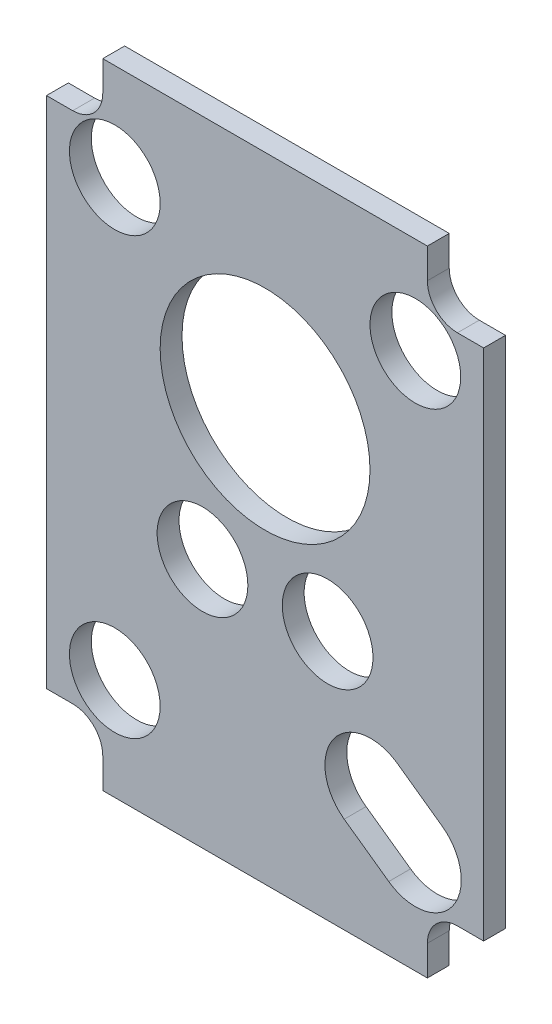
ISO-10303-21;
HEADER;
FILE_DESCRIPTION(('STEP AP214'),'2;1');
FILE_NAME('part.step','',(''),(''),'','','');
FILE_SCHEMA(('AUTOMOTIVE_DESIGN { 1 0 10303 214 1 1 1 1 }'));
ENDSEC;
DATA;
#1=APPLICATION_CONTEXT('core data for automotive mechanical design processes');
#2=APPLICATION_PROTOCOL_DEFINITION('international standard','automotive_design',2000,#1);
#3=PRODUCT_CONTEXT('',#1,'mechanical');
#4=PRODUCT('Part','Part','',(#3));
#5=PRODUCT_RELATED_PRODUCT_CATEGORY('part','',(#4));
#6=PRODUCT_DEFINITION_FORMATION('','',#4);
#7=PRODUCT_DEFINITION_CONTEXT('part definition',#1,'design');
#8=PRODUCT_DEFINITION('design','',#6,#7);
#9=PRODUCT_DEFINITION_SHAPE('','',#8);
#10=(LENGTH_UNIT() NAMED_UNIT(*) SI_UNIT(.MILLI.,.METRE.));
#11=(NAMED_UNIT(*) PLANE_ANGLE_UNIT() SI_UNIT($,.RADIAN.));
#12=(NAMED_UNIT(*) SI_UNIT($,.STERADIAN.) SOLID_ANGLE_UNIT());
#13=UNCERTAINTY_MEASURE_WITH_UNIT(LENGTH_MEASURE(1.E-05),#10,'distance_accuracy_value','');
#14=(GEOMETRIC_REPRESENTATION_CONTEXT(3) GLOBAL_UNCERTAINTY_ASSIGNED_CONTEXT((#13)) GLOBAL_UNIT_ASSIGNED_CONTEXT((#10,
#11,#12)) REPRESENTATION_CONTEXT('',''));
#15=CARTESIAN_POINT('',(0.,0.,0.));
#16=DIRECTION('',(0.,0.,1.));
#17=DIRECTION('',(1.,0.,0.));
#18=AXIS2_PLACEMENT_3D('',#15,#16,#17);
#19=CARTESIAN_POINT('',(9.67691762911674,-16.8,2.));
#20=DIRECTION('',(0.,0.,-1.));
#21=DIRECTION('',(-1.,0.,0.));
#22=AXIS2_PLACEMENT_3D('',#19,#20,#21);
#23=CYLINDRICAL_SURFACE('',#22,4.2);
#24=CARTESIAN_POINT('',(9.67691762911674,-16.8,0.));
#25=DIRECTION('',(0.,0.,1.));
#26=DIRECTION('',(1.,0.,0.));
#27=AXIS2_PLACEMENT_3D('',#24,#25,#26);
#28=CIRCLE('',#27,4.2);
#29=CARTESIAN_POINT('',(12.1129176291167,-13.3786108084581,0.));
#30=VERTEX_POINT('',#29);
#31=CARTESIAN_POINT('',(7.24091762911673,-20.2213891915419,0.));
#32=VERTEX_POINT('',#31);
#33=EDGE_CURVE('E271',#30,#32,#28,.T.);
#34=ORIENTED_EDGE('',*,*,#33,.F.);
#35=DIRECTION('',(0.,0.,-1.));
#36=VECTOR('',#35,1.);
#37=CARTESIAN_POINT('',(12.1129176291167,-13.3786108084581,2.));
#38=LINE('',#37,#36);
#39=CARTESIAN_POINT('',(12.1129176291167,-13.3786108084581,2.));
#40=VERTEX_POINT('',#39);
#41=EDGE_CURVE('E11',#40,#30,#38,.T.);
#42=ORIENTED_EDGE('',*,*,#41,.F.);
#43=CARTESIAN_POINT('',(9.67691762911674,-16.8,2.));
#44=DIRECTION('',(0.,0.,1.));
#45=DIRECTION('',(1.,0.,0.));
#46=AXIS2_PLACEMENT_3D('',#43,#44,#45);
#47=CIRCLE('',#46,4.2);
#48=CARTESIAN_POINT('',(7.24091762911673,-20.2213891915419,2.));
#49=VERTEX_POINT('',#48);
#50=EDGE_CURVE('E199',#40,#49,#47,.T.);
#51=ORIENTED_EDGE('',*,*,#50,.T.);
#52=DIRECTION('',(0.,0.,-1.));
#53=VECTOR('',#52,1.);
#54=CARTESIAN_POINT('',(7.24091762911673,-20.2213891915419,2.));
#55=LINE('',#54,#53);
#56=EDGE_CURVE('E127',#49,#32,#55,.T.);
#57=ORIENTED_EDGE('',*,*,#56,.T.);
#58=EDGE_LOOP('',(#34,#42,#51,#57));
#59=FACE_BOUND('',#58,.T.);
#60=ADVANCED_FACE('F38',(#59),#23,.F.);
#61=CARTESIAN_POINT('',(-2.24630783394242,-3.15496442689925,2.));
#62=DIRECTION('',(-0.580000000000001,-0.814616474176652,0.));
#63=DIRECTION('',(0.814616474176652,-0.580000000000001,0.));
#64=AXIS2_PLACEMENT_3D('',#61,#62,#63);
#65=PLANE('',#64);
#66=DIRECTION('',(-0.814616474176652,0.580000000000001,0.));
#67=VECTOR('',#66,1.);
#68=CARTESIAN_POINT('',(-2.24630783394242,-3.15496442689925,0.));
#69=LINE('',#68,#67);
#70=CARTESIAN_POINT('',(16.186,-16.2786108084581,0.));
#71=VERTEX_POINT('',#70);
#72=EDGE_CURVE('E190',#71,#30,#69,.T.);
#73=ORIENTED_EDGE('',*,*,#72,.F.);
#74=DIRECTION('',(0.,0.,-1.));
#75=VECTOR('',#74,1.);
#76=CARTESIAN_POINT('',(16.186,-16.2786108084581,2.));
#77=LINE('',#76,#75);
#78=CARTESIAN_POINT('',(16.186,-16.2786108084581,2.));
#79=VERTEX_POINT('',#78);
#80=EDGE_CURVE('E48',#79,#71,#77,.T.);
#81=ORIENTED_EDGE('',*,*,#80,.F.);
#82=DIRECTION('',(-0.814616474176652,0.580000000000001,0.));
#83=VECTOR('',#82,1.);
#84=CARTESIAN_POINT('',(-2.24630783394242,-3.15496442689925,2.));
#85=LINE('',#84,#83);
#86=EDGE_CURVE('E188',#79,#40,#85,.T.);
#87=ORIENTED_EDGE('',*,*,#86,.T.);
#88=ORIENTED_EDGE('',*,*,#41,.T.);
#89=EDGE_LOOP('',(#73,#81,#87,#88));
#90=FACE_BOUND('',#89,.T.);
#91=ADVANCED_FACE('F187',(#90),#65,.T.);
#92=CARTESIAN_POINT('',(13.75,-19.7,2.));
#93=DIRECTION('',(0.,0.,-1.));
#94=DIRECTION('',(-1.,0.,0.));
#95=AXIS2_PLACEMENT_3D('',#92,#93,#94);
#96=CYLINDRICAL_SURFACE('',#95,4.2);
#97=CARTESIAN_POINT('',(13.75,-19.7,0.));
#98=DIRECTION('',(0.,0.,1.));
#99=DIRECTION('',(1.,0.,0.));
#100=AXIS2_PLACEMENT_3D('',#97,#98,#99);
#101=CIRCLE('',#100,4.2);
#102=CARTESIAN_POINT('',(11.314,-23.1213891915419,0.));
#103=VERTEX_POINT('',#102);
#104=EDGE_CURVE('E275',#103,#71,#101,.T.);
#105=ORIENTED_EDGE('',*,*,#104,.F.);
#106=DIRECTION('',(0.,0.,-1.));
#107=VECTOR('',#106,1.);
#108=CARTESIAN_POINT('',(11.314,-23.1213891915419,2.));
#109=LINE('',#108,#107);
#110=CARTESIAN_POINT('',(11.314,-23.1213891915419,2.));
#111=VERTEX_POINT('',#110);
#112=EDGE_CURVE('E120',#111,#103,#109,.T.);
#113=ORIENTED_EDGE('',*,*,#112,.F.);
#114=CARTESIAN_POINT('',(13.75,-19.7,2.));
#115=DIRECTION('',(0.,0.,1.));
#116=DIRECTION('',(1.,0.,0.));
#117=AXIS2_PLACEMENT_3D('',#114,#115,#116);
#118=CIRCLE('',#117,4.2);
#119=EDGE_CURVE('E198',#111,#79,#118,.T.);
#120=ORIENTED_EDGE('',*,*,#119,.T.);
#121=ORIENTED_EDGE('',*,*,#80,.T.);
#122=EDGE_LOOP('',(#105,#113,#120,#121));
#123=FACE_BOUND('',#122,.T.);
#124=ADVANCED_FACE('F201',(#123),#96,.F.);
#125=CARTESIAN_POINT('',(17.6,26.25,2.));
#126=DIRECTION('',(0.,0.,-1.));
#127=DIRECTION('',(-1.,0.,0.));
#128=AXIS2_PLACEMENT_3D('',#125,#126,#127);
#129=CYLINDRICAL_SURFACE('',#128,2.75);
#130=CARTESIAN_POINT('',(17.6,26.25,0.));
#131=DIRECTION('',(0.,0.,1.));
#132=DIRECTION('',(1.,0.,0.));
#133=AXIS2_PLACEMENT_3D('',#130,#131,#132);
#134=CIRCLE('',#133,2.75);
#135=CARTESIAN_POINT('',(14.85,26.25,0.));
#136=VERTEX_POINT('',#135);
#137=CARTESIAN_POINT('',(17.6,23.5,0.));
#138=VERTEX_POINT('',#137);
#139=EDGE_CURVE('E216',#136,#138,#134,.T.);
#140=ORIENTED_EDGE('',*,*,#139,.F.);
#141=DIRECTION('',(0.,0.,-1.));
#142=VECTOR('',#141,1.);
#143=CARTESIAN_POINT('',(14.85,26.25,2.));
#144=LINE('',#143,#142);
#145=CARTESIAN_POINT('',(14.85,26.25,2.));
#146=VERTEX_POINT('',#145);
#147=EDGE_CURVE('E42',#146,#136,#144,.T.);
#148=ORIENTED_EDGE('',*,*,#147,.F.);
#149=CARTESIAN_POINT('',(17.6,26.25,2.));
#150=DIRECTION('',(0.,0.,1.));
#151=DIRECTION('',(1.,0.,0.));
#152=AXIS2_PLACEMENT_3D('',#149,#150,#151);
#153=CIRCLE('',#152,2.75);
#154=CARTESIAN_POINT('',(17.6,23.5,2.));
#155=VERTEX_POINT('',#154);
#156=EDGE_CURVE('E288',#146,#155,#153,.T.);
#157=ORIENTED_EDGE('',*,*,#156,.T.);
#158=DIRECTION('',(0.,0.,-1.));
#159=VECTOR('',#158,1.);
#160=CARTESIAN_POINT('',(17.6,23.5,2.));
#161=LINE('',#160,#159);
#162=EDGE_CURVE('E215',#155,#138,#161,.T.);
#163=ORIENTED_EDGE('',*,*,#162,.T.);
#164=EDGE_LOOP('',(#140,#148,#157,#163));
#165=FACE_BOUND('',#164,.T.);
#166=ADVANCED_FACE('F40',(#165),#129,.F.);
#167=CARTESIAN_POINT('',(14.85,0.,2.));
#168=DIRECTION('',(-1.,0.,0.));
#169=DIRECTION('',(0.,-1.,0.));
#170=AXIS2_PLACEMENT_3D('',#167,#168,#169);
#171=PLANE('',#170);
#172=DIRECTION('',(0.,1.,0.));
#173=VECTOR('',#172,1.);
#174=CARTESIAN_POINT('',(14.85,0.,0.));
#175=LINE('',#174,#173);
#176=CARTESIAN_POINT('',(14.85,29.,0.));
#177=VERTEX_POINT('',#176);
#178=EDGE_CURVE('E219',#136,#177,#175,.T.);
#179=ORIENTED_EDGE('',*,*,#178,.T.);
#180=DIRECTION('',(0.,0.,-1.));
#181=VECTOR('',#180,1.);
#182=CARTESIAN_POINT('',(14.85,29.,2.));
#183=LINE('',#182,#181);
#184=CARTESIAN_POINT('',(14.85,29.,2.));
#185=VERTEX_POINT('',#184);
#186=EDGE_CURVE('E318',#185,#177,#183,.T.);
#187=ORIENTED_EDGE('',*,*,#186,.F.);
#188=DIRECTION('',(0.,1.,0.));
#189=VECTOR('',#188,1.);
#190=CARTESIAN_POINT('',(14.85,0.,2.));
#191=LINE('',#190,#189);
#192=EDGE_CURVE('E327',#146,#185,#191,.T.);
#193=ORIENTED_EDGE('',*,*,#192,.F.);
#194=ORIENTED_EDGE('',*,*,#147,.T.);
#195=EDGE_LOOP('',(#179,#187,#193,#194));
#196=FACE_BOUND('',#195,.T.);
#197=ADVANCED_FACE('F326',(#196),#171,.F.);
#198=CARTESIAN_POINT('',(0.,29.,2.));
#199=DIRECTION('',(0.,-1.,0.));
#200=DIRECTION('',(1.,0.,0.));
#201=AXIS2_PLACEMENT_3D('',#198,#199,#200);
#202=PLANE('',#201);
#203=DIRECTION('',(-1.,0.,0.));
#204=VECTOR('',#203,1.);
#205=CARTESIAN_POINT('',(0.,29.,0.));
#206=LINE('',#205,#204);
#207=CARTESIAN_POINT('',(-14.85,29.,0.));
#208=VERTEX_POINT('',#207);
#209=EDGE_CURVE('E221',#177,#208,#206,.T.);
#210=ORIENTED_EDGE('',*,*,#209,.T.);
#211=DIRECTION('',(0.,0.,-1.));
#212=VECTOR('',#211,1.);
#213=CARTESIAN_POINT('',(-14.85,29.,2.));
#214=LINE('',#213,#212);
#215=CARTESIAN_POINT('',(-14.85,29.,2.));
#216=VERTEX_POINT('',#215);
#217=EDGE_CURVE('E317',#216,#208,#214,.T.);
#218=ORIENTED_EDGE('',*,*,#217,.F.);
#219=DIRECTION('',(-1.,0.,0.));
#220=VECTOR('',#219,1.);
#221=CARTESIAN_POINT('',(0.,29.,2.));
#222=LINE('',#221,#220);
#223=EDGE_CURVE('E677',#185,#216,#222,.T.);
#224=ORIENTED_EDGE('',*,*,#223,.F.);
#225=ORIENTED_EDGE('',*,*,#186,.T.);
#226=EDGE_LOOP('',(#210,#218,#224,#225));
#227=FACE_BOUND('',#226,.T.);
#228=ADVANCED_FACE('F409',(#227),#202,.F.);
#229=CARTESIAN_POINT('',(-14.85,0.,2.));
#230=DIRECTION('',(-1.,0.,0.));
#231=DIRECTION('',(0.,-1.,0.));
#232=AXIS2_PLACEMENT_3D('',#229,#230,#231);
#233=PLANE('',#232);
#234=DIRECTION('',(0.,1.,0.));
#235=VECTOR('',#234,1.);
#236=CARTESIAN_POINT('',(-14.85,0.,0.));
#237=LINE('',#236,#235);
#238=CARTESIAN_POINT('',(-14.85,26.25,0.));
#239=VERTEX_POINT('',#238);
#240=EDGE_CURVE('E224',#239,#208,#237,.T.);
#241=ORIENTED_EDGE('',*,*,#240,.F.);
#242=DIRECTION('',(0.,0.,-1.));
#243=VECTOR('',#242,1.);
#244=CARTESIAN_POINT('',(-14.85,26.25,2.));
#245=LINE('',#244,#243);
#246=CARTESIAN_POINT('',(-14.85,26.25,2.));
#247=VERTEX_POINT('',#246);
#248=EDGE_CURVE('E315',#247,#239,#245,.T.);
#249=ORIENTED_EDGE('',*,*,#248,.F.);
#250=DIRECTION('',(0.,1.,0.));
#251=VECTOR('',#250,1.);
#252=CARTESIAN_POINT('',(-14.85,0.,2.));
#253=LINE('',#252,#251);
#254=EDGE_CURVE('E408',#247,#216,#253,.T.);
#255=ORIENTED_EDGE('',*,*,#254,.T.);
#256=ORIENTED_EDGE('',*,*,#217,.T.);
#257=EDGE_LOOP('',(#241,#249,#255,#256));
#258=FACE_BOUND('',#257,.T.);
#259=ADVANCED_FACE('F404',(#258),#233,.T.);
#260=CARTESIAN_POINT('',(-17.6,26.25,2.));
#261=DIRECTION('',(0.,0.,-1.));
#262=DIRECTION('',(-1.,0.,0.));
#263=AXIS2_PLACEMENT_3D('',#260,#261,#262);
#264=CYLINDRICAL_SURFACE('',#263,2.75);
#265=CARTESIAN_POINT('',(-17.6,26.25,0.));
#266=DIRECTION('',(0.,0.,1.));
#267=DIRECTION('',(1.,0.,0.));
#268=AXIS2_PLACEMENT_3D('',#265,#266,#267);
#269=CIRCLE('',#268,2.75);
#270=CARTESIAN_POINT('',(-17.6,23.5,0.));
#271=VERTEX_POINT('',#270);
#272=EDGE_CURVE('E227',#271,#239,#269,.T.);
#273=ORIENTED_EDGE('',*,*,#272,.F.);
#274=DIRECTION('',(0.,0.,-1.));
#275=VECTOR('',#274,1.);
#276=CARTESIAN_POINT('',(-17.6,23.5,2.));
#277=LINE('',#276,#275);
#278=CARTESIAN_POINT('',(-17.6,23.5,2.));
#279=VERTEX_POINT('',#278);
#280=EDGE_CURVE('E313',#279,#271,#277,.T.);
#281=ORIENTED_EDGE('',*,*,#280,.F.);
#282=CARTESIAN_POINT('',(-17.6,26.25,2.));
#283=DIRECTION('',(0.,0.,1.));
#284=DIRECTION('',(1.,0.,0.));
#285=AXIS2_PLACEMENT_3D('',#282,#283,#284);
#286=CIRCLE('',#285,2.75);
#287=EDGE_CURVE('E401',#279,#247,#286,.T.);
#288=ORIENTED_EDGE('',*,*,#287,.T.);
#289=ORIENTED_EDGE('',*,*,#248,.T.);
#290=EDGE_LOOP('',(#273,#281,#288,#289));
#291=FACE_BOUND('',#290,.T.);
#292=ADVANCED_FACE('F400',(#291),#264,.F.);
#293=CARTESIAN_POINT('',(0.,23.5,2.));
#294=DIRECTION('',(0.,-1.,0.));
#295=DIRECTION('',(0.,0.,-1.));
#296=AXIS2_PLACEMENT_3D('',#293,#294,#295);
#297=PLANE('',#296);
#298=DIRECTION('',(-1.,0.,0.));
#299=VECTOR('',#298,1.);
#300=CARTESIAN_POINT('',(0.,23.5,0.));
#301=LINE('',#300,#299);
#302=CARTESIAN_POINT('',(-20.,23.5,0.));
#303=VERTEX_POINT('',#302);
#304=EDGE_CURVE('E230',#271,#303,#301,.T.);
#305=ORIENTED_EDGE('',*,*,#304,.T.);
#306=DIRECTION('',(0.,0.,-1.));
#307=VECTOR('',#306,1.);
#308=CARTESIAN_POINT('',(-20.,23.5,2.));
#309=LINE('',#308,#307);
#310=CARTESIAN_POINT('',(-20.,23.5,2.));
#311=VERTEX_POINT('',#310);
#312=EDGE_CURVE('E311',#311,#303,#309,.T.);
#313=ORIENTED_EDGE('',*,*,#312,.F.);
#314=DIRECTION('',(-1.,0.,0.));
#315=VECTOR('',#314,1.);
#316=CARTESIAN_POINT('',(0.,23.5,2.));
#317=LINE('',#316,#315);
#318=EDGE_CURVE('E396',#279,#311,#317,.T.);
#319=ORIENTED_EDGE('',*,*,#318,.F.);
#320=ORIENTED_EDGE('',*,*,#280,.T.);
#321=EDGE_LOOP('',(#305,#313,#319,#320));
#322=FACE_BOUND('',#321,.T.);
#323=ADVANCED_FACE('F395',(#322),#297,.F.);
#324=CARTESIAN_POINT('',(-20.,0.,2.));
#325=DIRECTION('',(-1.,0.,0.));
#326=DIRECTION('',(0.,0.,1.));
#327=AXIS2_PLACEMENT_3D('',#324,#325,#326);
#328=PLANE('',#327);
#329=DIRECTION('',(0.,1.,0.));
#330=VECTOR('',#329,1.);
#331=CARTESIAN_POINT('',(-20.,0.,0.));
#332=LINE('',#331,#330);
#333=CARTESIAN_POINT('',(-20.,-23.5,0.));
#334=VERTEX_POINT('',#333);
#335=EDGE_CURVE('E233',#334,#303,#332,.T.);
#336=ORIENTED_EDGE('',*,*,#335,.F.);
#337=DIRECTION('',(0.,0.,-1.));
#338=VECTOR('',#337,1.);
#339=CARTESIAN_POINT('',(-20.,-23.5,2.));
#340=LINE('',#339,#338);
#341=CARTESIAN_POINT('',(-20.,-23.5,2.));
#342=VERTEX_POINT('',#341);
#343=EDGE_CURVE('E309',#342,#334,#340,.T.);
#344=ORIENTED_EDGE('',*,*,#343,.F.);
#345=DIRECTION('',(0.,1.,0.));
#346=VECTOR('',#345,1.);
#347=CARTESIAN_POINT('',(-20.,0.,2.));
#348=LINE('',#347,#346);
#349=EDGE_CURVE('E392',#342,#311,#348,.T.);
#350=ORIENTED_EDGE('',*,*,#349,.T.);
#351=ORIENTED_EDGE('',*,*,#312,.T.);
#352=EDGE_LOOP('',(#336,#344,#350,#351));
#353=FACE_BOUND('',#352,.T.);
#354=ADVANCED_FACE('F388',(#353),#328,.T.);
#355=CARTESIAN_POINT('',(0.,-23.4999999999999,2.));
#356=DIRECTION('',(0.,-1.,0.));
#357=DIRECTION('',(1.,0.,0.));
#358=AXIS2_PLACEMENT_3D('',#355,#356,#357);
#359=PLANE('',#358);
#360=DIRECTION('',(-1.,0.,0.));
#361=VECTOR('',#360,1.);
#362=CARTESIAN_POINT('',(0.,-23.4999999999999,0.));
#363=LINE('',#362,#361);
#364=CARTESIAN_POINT('',(-17.6,-23.5,0.));
#365=VERTEX_POINT('',#364);
#366=EDGE_CURVE('E236',#365,#334,#363,.T.);
#367=ORIENTED_EDGE('',*,*,#366,.F.);
#368=DIRECTION('',(0.,0.,-1.));
#369=VECTOR('',#368,1.);
#370=CARTESIAN_POINT('',(-17.6,-23.5,2.));
#371=LINE('',#370,#369);
#372=CARTESIAN_POINT('',(-17.6,-23.5,2.));
#373=VERTEX_POINT('',#372);
#374=EDGE_CURVE('E307',#373,#365,#371,.T.);
#375=ORIENTED_EDGE('',*,*,#374,.F.);
#376=DIRECTION('',(-1.,0.,0.));
#377=VECTOR('',#376,1.);
#378=CARTESIAN_POINT('',(0.,-23.4999999999999,2.));
#379=LINE('',#378,#377);
#380=EDGE_CURVE('E671',#373,#342,#379,.T.);
#381=ORIENTED_EDGE('',*,*,#380,.T.);
#382=ORIENTED_EDGE('',*,*,#343,.T.);
#383=EDGE_LOOP('',(#367,#375,#381,#382));
#384=FACE_BOUND('',#383,.T.);
#385=ADVANCED_FACE('F383',(#384),#359,.T.);
#386=CARTESIAN_POINT('',(-17.6,-26.25,2.));
#387=DIRECTION('',(0.,0.,-1.));
#388=DIRECTION('',(-1.,0.,0.));
#389=AXIS2_PLACEMENT_3D('',#386,#387,#388);
#390=CYLINDRICAL_SURFACE('',#389,2.75);
#391=CARTESIAN_POINT('',(-17.6,-26.25,0.));
#392=DIRECTION('',(0.,0.,1.));
#393=DIRECTION('',(1.,0.,0.));
#394=AXIS2_PLACEMENT_3D('',#391,#392,#393);
#395=CIRCLE('',#394,2.75);
#396=CARTESIAN_POINT('',(-14.85,-26.25,0.));
#397=VERTEX_POINT('',#396);
#398=EDGE_CURVE('E239',#397,#365,#395,.T.);
#399=ORIENTED_EDGE('',*,*,#398,.F.);
#400=DIRECTION('',(0.,0.,-1.));
#401=VECTOR('',#400,1.);
#402=CARTESIAN_POINT('',(-14.85,-26.25,2.));
#403=LINE('',#402,#401);
#404=CARTESIAN_POINT('',(-14.85,-26.25,2.));
#405=VERTEX_POINT('',#404);
#406=EDGE_CURVE('E305',#405,#397,#403,.T.);
#407=ORIENTED_EDGE('',*,*,#406,.F.);
#408=CARTESIAN_POINT('',(-17.6,-26.25,2.));
#409=DIRECTION('',(0.,0.,1.));
#410=DIRECTION('',(1.,0.,0.));
#411=AXIS2_PLACEMENT_3D('',#408,#409,#410);
#412=CIRCLE('',#411,2.75);
#413=EDGE_CURVE('E379',#405,#373,#412,.T.);
#414=ORIENTED_EDGE('',*,*,#413,.T.);
#415=ORIENTED_EDGE('',*,*,#374,.T.);
#416=EDGE_LOOP('',(#399,#407,#414,#415));
#417=FACE_BOUND('',#416,.T.);
#418=ADVANCED_FACE('F375',(#417),#390,.F.);
#419=CARTESIAN_POINT('',(-14.85,0.,2.));
#420=DIRECTION('',(1.,0.,0.));
#421=DIRECTION('',(0.,1.,0.));
#422=AXIS2_PLACEMENT_3D('',#419,#420,#421);
#423=PLANE('',#422);
#424=DIRECTION('',(0.,-1.,0.));
#425=VECTOR('',#424,1.);
#426=CARTESIAN_POINT('',(-14.85,0.,0.));
#427=LINE('',#426,#425);
#428=CARTESIAN_POINT('',(-14.85,-29.,0.));
#429=VERTEX_POINT('',#428);
#430=EDGE_CURVE('E242',#397,#429,#427,.T.);
#431=ORIENTED_EDGE('',*,*,#430,.T.);
#432=DIRECTION('',(0.,0.,-1.));
#433=VECTOR('',#432,1.);
#434=CARTESIAN_POINT('',(-14.85,-29.,2.));
#435=LINE('',#434,#433);
#436=CARTESIAN_POINT('',(-14.85,-29.,2.));
#437=VERTEX_POINT('',#436);
#438=EDGE_CURVE('E303',#437,#429,#435,.T.);
#439=ORIENTED_EDGE('',*,*,#438,.F.);
#440=DIRECTION('',(0.,-1.,0.));
#441=VECTOR('',#440,1.);
#442=CARTESIAN_POINT('',(-14.85,0.,2.));
#443=LINE('',#442,#441);
#444=EDGE_CURVE('E668',#405,#437,#443,.T.);
#445=ORIENTED_EDGE('',*,*,#444,.F.);
#446=ORIENTED_EDGE('',*,*,#406,.T.);
#447=EDGE_LOOP('',(#431,#439,#445,#446));
#448=FACE_BOUND('',#447,.T.);
#449=ADVANCED_FACE('F372',(#448),#423,.F.);
#450=CARTESIAN_POINT('',(0.,-29.,2.));
#451=DIRECTION('',(0.,-1.,0.));
#452=DIRECTION('',(1.,0.,0.));
#453=AXIS2_PLACEMENT_3D('',#450,#451,#452);
#454=PLANE('',#453);
#455=DIRECTION('',(-1.,0.,0.));
#456=VECTOR('',#455,1.);
#457=CARTESIAN_POINT('',(0.,-29.,0.));
#458=LINE('',#457,#456);
#459=CARTESIAN_POINT('',(14.85,-29.,0.));
#460=VERTEX_POINT('',#459);
#461=EDGE_CURVE('E245',#460,#429,#458,.T.);
#462=ORIENTED_EDGE('',*,*,#461,.F.);
#463=DIRECTION('',(0.,0.,-1.));
#464=VECTOR('',#463,1.);
#465=CARTESIAN_POINT('',(14.85,-29.,2.));
#466=LINE('',#465,#464);
#467=CARTESIAN_POINT('',(14.85,-29.,2.));
#468=VERTEX_POINT('',#467);
#469=EDGE_CURVE('E301',#468,#460,#466,.T.);
#470=ORIENTED_EDGE('',*,*,#469,.F.);
#471=DIRECTION('',(-1.,0.,0.));
#472=VECTOR('',#471,1.);
#473=CARTESIAN_POINT('',(0.,-29.,2.));
#474=LINE('',#473,#472);
#475=EDGE_CURVE('E369',#468,#437,#474,.T.);
#476=ORIENTED_EDGE('',*,*,#475,.T.);
#477=ORIENTED_EDGE('',*,*,#438,.T.);
#478=EDGE_LOOP('',(#462,#470,#476,#477));
#479=FACE_BOUND('',#478,.T.);
#480=ADVANCED_FACE('F367',(#479),#454,.T.);
#481=CARTESIAN_POINT('',(14.85,0.,2.));
#482=DIRECTION('',(1.,0.,0.));
#483=DIRECTION('',(0.,1.,0.));
#484=AXIS2_PLACEMENT_3D('',#481,#482,#483);
#485=PLANE('',#484);
#486=DIRECTION('',(0.,-1.,0.));
#487=VECTOR('',#486,1.);
#488=CARTESIAN_POINT('',(14.85,0.,0.));
#489=LINE('',#488,#487);
#490=CARTESIAN_POINT('',(14.85,-26.25,0.));
#491=VERTEX_POINT('',#490);
#492=EDGE_CURVE('E248',#491,#460,#489,.T.);
#493=ORIENTED_EDGE('',*,*,#492,.F.);
#494=DIRECTION('',(0.,0.,-1.));
#495=VECTOR('',#494,1.);
#496=CARTESIAN_POINT('',(14.85,-26.25,2.));
#497=LINE('',#496,#495);
#498=CARTESIAN_POINT('',(14.85,-26.25,2.));
#499=VERTEX_POINT('',#498);
#500=EDGE_CURVE('E299',#499,#491,#497,.T.);
#501=ORIENTED_EDGE('',*,*,#500,.F.);
#502=DIRECTION('',(0.,-1.,0.));
#503=VECTOR('',#502,1.);
#504=CARTESIAN_POINT('',(14.85,0.,2.));
#505=LINE('',#504,#503);
#506=EDGE_CURVE('E363',#499,#468,#505,.T.);
#507=ORIENTED_EDGE('',*,*,#506,.T.);
#508=ORIENTED_EDGE('',*,*,#469,.T.);
#509=EDGE_LOOP('',(#493,#501,#507,#508));
#510=FACE_BOUND('',#509,.T.);
#511=ADVANCED_FACE('F360',(#510),#485,.T.);
#512=CARTESIAN_POINT('',(17.6,-26.25,2.));
#513=DIRECTION('',(0.,0.,-1.));
#514=DIRECTION('',(-1.,0.,0.));
#515=AXIS2_PLACEMENT_3D('',#512,#513,#514);
#516=CYLINDRICAL_SURFACE('',#515,2.75);
#517=CARTESIAN_POINT('',(17.6,-26.25,0.));
#518=DIRECTION('',(0.,0.,1.));
#519=DIRECTION('',(1.,0.,0.));
#520=AXIS2_PLACEMENT_3D('',#517,#518,#519);
#521=CIRCLE('',#520,2.75);
#522=CARTESIAN_POINT('',(17.6,-23.5,0.));
#523=VERTEX_POINT('',#522);
#524=EDGE_CURVE('E251',#523,#491,#521,.T.);
#525=ORIENTED_EDGE('',*,*,#524,.F.);
#526=DIRECTION('',(0.,0.,-1.));
#527=VECTOR('',#526,1.);
#528=CARTESIAN_POINT('',(17.6,-23.5,2.));
#529=LINE('',#528,#527);
#530=CARTESIAN_POINT('',(17.6,-23.5,2.));
#531=VERTEX_POINT('',#530);
#532=EDGE_CURVE('E297',#531,#523,#529,.T.);
#533=ORIENTED_EDGE('',*,*,#532,.F.);
#534=CARTESIAN_POINT('',(17.6,-26.25,2.));
#535=DIRECTION('',(0.,0.,1.));
#536=DIRECTION('',(1.,0.,0.));
#537=AXIS2_PLACEMENT_3D('',#534,#535,#536);
#538=CIRCLE('',#537,2.75);
#539=EDGE_CURVE('E355',#531,#499,#538,.T.);
#540=ORIENTED_EDGE('',*,*,#539,.T.);
#541=ORIENTED_EDGE('',*,*,#500,.T.);
#542=EDGE_LOOP('',(#525,#533,#540,#541));
#543=FACE_BOUND('',#542,.T.);
#544=ADVANCED_FACE('F354',(#543),#516,.F.);
#545=CARTESIAN_POINT('',(0.,-23.4999999999999,2.));
#546=DIRECTION('',(0.,1.,0.));
#547=DIRECTION('',(-1.,0.,0.));
#548=AXIS2_PLACEMENT_3D('',#545,#546,#547);
#549=PLANE('',#548);
#550=DIRECTION('',(1.,0.,0.));
#551=VECTOR('',#550,1.);
#552=CARTESIAN_POINT('',(0.,-23.4999999999999,0.));
#553=LINE('',#552,#551);
#554=CARTESIAN_POINT('',(20.,-23.5,0.));
#555=VERTEX_POINT('',#554);
#556=EDGE_CURVE('E254',#523,#555,#553,.T.);
#557=ORIENTED_EDGE('',*,*,#556,.T.);
#558=DIRECTION('',(0.,0.,-1.));
#559=VECTOR('',#558,1.);
#560=CARTESIAN_POINT('',(20.,-23.5,2.));
#561=LINE('',#560,#559);
#562=CARTESIAN_POINT('',(20.,-23.5,2.));
#563=VERTEX_POINT('',#562);
#564=EDGE_CURVE('E294',#563,#555,#561,.T.);
#565=ORIENTED_EDGE('',*,*,#564,.F.);
#566=DIRECTION('',(1.,0.,0.));
#567=VECTOR('',#566,1.);
#568=CARTESIAN_POINT('',(0.,-23.4999999999999,2.));
#569=LINE('',#568,#567);
#570=EDGE_CURVE('E350',#531,#563,#569,.T.);
#571=ORIENTED_EDGE('',*,*,#570,.F.);
#572=ORIENTED_EDGE('',*,*,#532,.T.);
#573=EDGE_LOOP('',(#557,#565,#571,#572));
#574=FACE_BOUND('',#573,.T.);
#575=ADVANCED_FACE('F349',(#574),#549,.F.);
#576=CARTESIAN_POINT('',(20.,0.,2.));
#577=DIRECTION('',(-1.,0.,0.));
#578=DIRECTION('',(0.,0.,1.));
#579=AXIS2_PLACEMENT_3D('',#576,#577,#578);
#580=PLANE('',#579);
#581=DIRECTION('',(0.,1.,0.));
#582=VECTOR('',#581,1.);
#583=CARTESIAN_POINT('',(20.,0.,0.));
#584=LINE('',#583,#582);
#585=CARTESIAN_POINT('',(20.,23.5,0.));
#586=VERTEX_POINT('',#585);
#587=EDGE_CURVE('E256',#555,#586,#584,.T.);
#588=ORIENTED_EDGE('',*,*,#587,.T.);
#589=DIRECTION('',(0.,0.,-1.));
#590=VECTOR('',#589,1.);
#591=CARTESIAN_POINT('',(20.,23.5,2.));
#592=LINE('',#591,#590);
#593=CARTESIAN_POINT('',(20.,23.5,2.));
#594=VERTEX_POINT('',#593);
#595=EDGE_CURVE('E292',#594,#586,#592,.T.);
#596=ORIENTED_EDGE('',*,*,#595,.F.);
#597=DIRECTION('',(0.,1.,0.));
#598=VECTOR('',#597,1.);
#599=CARTESIAN_POINT('',(20.,0.,2.));
#600=LINE('',#599,#598);
#601=EDGE_CURVE('E346',#563,#594,#600,.T.);
#602=ORIENTED_EDGE('',*,*,#601,.F.);
#603=ORIENTED_EDGE('',*,*,#564,.T.);
#604=EDGE_LOOP('',(#588,#596,#602,#603));
#605=FACE_BOUND('',#604,.T.);
#606=ADVANCED_FACE('F343',(#605),#580,.F.);
#607=CARTESIAN_POINT('',(13.75,20.15,2.));
#608=DIRECTION('',(0.,0.,-1.));
#609=DIRECTION('',(-1.,0.,0.));
#610=AXIS2_PLACEMENT_3D('',#607,#608,#609);
#611=CYLINDRICAL_SURFACE('',#610,4.15);
#612=CARTESIAN_POINT('',(13.75,20.15,2.));
#613=DIRECTION('',(0.,0.,1.));
#614=DIRECTION('',(1.,0.,0.));
#615=AXIS2_PLACEMENT_3D('',#612,#613,#614);
#616=CIRCLE('',#615,4.15);
#617=CARTESIAN_POINT('',(17.9,20.15,2.));
#618=VERTEX_POINT('',#617);
#619=EDGE_CURVE('E209',#618,#618,#616,.T.);
#620=ORIENTED_EDGE('',*,*,#619,.T.);
#621=EDGE_LOOP('',(#620));
#622=FACE_BOUND('',#621,.T.);
#623=CARTESIAN_POINT('',(13.75,20.15,0.));
#624=DIRECTION('',(0.,0.,1.));
#625=DIRECTION('',(1.,0.,0.));
#626=AXIS2_PLACEMENT_3D('',#623,#624,#625);
#627=CIRCLE('',#626,4.15);
#628=CARTESIAN_POINT('',(17.9,20.15,0.));
#629=VERTEX_POINT('',#628);
#630=EDGE_CURVE('E282',#629,#629,#627,.T.);
#631=ORIENTED_EDGE('',*,*,#630,.F.);
#632=EDGE_LOOP('',(#631));
#633=FACE_BOUND('',#632,.T.);
#634=ADVANCED_FACE('F443',(#622,#633),#611,.F.);
#635=CARTESIAN_POINT('',(-13.75,-19.7,2.));
#636=DIRECTION('',(0.,0.,-1.));
#637=DIRECTION('',(-1.,0.,0.));
#638=AXIS2_PLACEMENT_3D('',#635,#636,#637);
#639=CYLINDRICAL_SURFACE('',#638,4.15);
#640=CARTESIAN_POINT('',(-13.75,-19.7,2.));
#641=DIRECTION('',(0.,0.,1.));
#642=DIRECTION('',(1.,0.,0.));
#643=AXIS2_PLACEMENT_3D('',#640,#641,#642);
#644=CIRCLE('',#643,4.15);
#645=CARTESIAN_POINT('',(-9.6,-19.7,2.));
#646=VERTEX_POINT('',#645);
#647=EDGE_CURVE('E203',#646,#646,#644,.T.);
#648=ORIENTED_EDGE('',*,*,#647,.T.);
#649=EDGE_LOOP('',(#648));
#650=FACE_BOUND('',#649,.T.);
#651=CARTESIAN_POINT('',(-13.75,-19.7,0.));
#652=DIRECTION('',(0.,0.,1.));
#653=DIRECTION('',(1.,0.,0.));
#654=AXIS2_PLACEMENT_3D('',#651,#652,#653);
#655=CIRCLE('',#654,4.15);
#656=CARTESIAN_POINT('',(-9.6,-19.7,0.));
#657=VERTEX_POINT('',#656);
#658=EDGE_CURVE('E279',#657,#657,#655,.T.);
#659=ORIENTED_EDGE('',*,*,#658,.F.);
#660=EDGE_LOOP('',(#659));
#661=FACE_BOUND('',#660,.T.);
#662=ADVANCED_FACE('F513',(#650,#661),#639,.F.);
#663=CARTESIAN_POINT('',(-7.11830783394243,-9.99774280998312,2.));
#664=DIRECTION('',(-0.580000000000001,-0.814616474176652,0.));
#665=DIRECTION('',(0.814616474176652,-0.580000000000001,0.));
#666=AXIS2_PLACEMENT_3D('',#663,#664,#665);
#667=PLANE('',#666);
#668=DIRECTION('',(-0.814616474176652,0.580000000000001,0.));
#669=VECTOR('',#668,1.);
#670=CARTESIAN_POINT('',(-7.11830783394243,-9.99774280998312,0.));
#671=LINE('',#670,#669);
#672=EDGE_CURVE('E277',#103,#32,#671,.T.);
#673=ORIENTED_EDGE('',*,*,#672,.T.);
#674=ORIENTED_EDGE('',*,*,#56,.F.);
#675=DIRECTION('',(-0.814616474176652,0.580000000000001,0.));
#676=VECTOR('',#675,1.);
#677=CARTESIAN_POINT('',(-7.11830783394243,-9.99774280998312,2.));
#678=LINE('',#677,#676);
#679=EDGE_CURVE('E57',#111,#49,#678,.T.);
#680=ORIENTED_EDGE('',*,*,#679,.F.);
#681=ORIENTED_EDGE('',*,*,#112,.T.);
#682=EDGE_LOOP('',(#673,#674,#680,#681));
#683=FACE_BOUND('',#682,.T.);
#684=ADVANCED_FACE('F429',(#683),#667,.F.);
#685=CARTESIAN_POINT('',(0.,8.65,2.));
#686=DIRECTION('',(0.,0.,-1.));
#687=DIRECTION('',(-1.,0.,0.));
#688=AXIS2_PLACEMENT_3D('',#685,#686,#687);
#689=CYLINDRICAL_SURFACE('',#688,9.6);
#690=CARTESIAN_POINT('',(0.,8.65,2.));
#691=DIRECTION('',(0.,0.,1.));
#692=DIRECTION('',(1.,0.,0.));
#693=AXIS2_PLACEMENT_3D('',#690,#691,#692);
#694=CIRCLE('',#693,9.6);
#695=CARTESIAN_POINT('',(9.6,8.65,2.));
#696=VERTEX_POINT('',#695);
#697=EDGE_CURVE('E657',#696,#696,#694,.T.);
#698=ORIENTED_EDGE('',*,*,#697,.T.);
#699=EDGE_LOOP('',(#698));
#700=FACE_BOUND('',#699,.T.);
#701=CARTESIAN_POINT('',(0.,8.65,0.));
#702=DIRECTION('',(0.,0.,1.));
#703=DIRECTION('',(1.,0.,0.));
#704=AXIS2_PLACEMENT_3D('',#701,#702,#703);
#705=CIRCLE('',#704,9.6);
#706=CARTESIAN_POINT('',(9.6,8.65,0.));
#707=VERTEX_POINT('',#706);
#708=EDGE_CURVE('E268',#707,#707,#705,.T.);
#709=ORIENTED_EDGE('',*,*,#708,.F.);
#710=EDGE_LOOP('',(#709));
#711=FACE_BOUND('',#710,.T.);
#712=ADVANCED_FACE('F425',(#700,#711),#689,.F.);
#713=CARTESIAN_POINT('',(-5.725,-6.1,2.));
#714=DIRECTION('',(0.,0.,-1.));
#715=DIRECTION('',(-1.,0.,0.));
#716=AXIS2_PLACEMENT_3D('',#713,#714,#715);
#717=CYLINDRICAL_SURFACE('',#716,4.15);
#718=CARTESIAN_POINT('',(-5.725,-6.1,2.));
#719=DIRECTION('',(0.,0.,1.));
#720=DIRECTION('',(1.,0.,0.));
#721=AXIS2_PLACEMENT_3D('',#718,#719,#720);
#722=CIRCLE('',#721,4.15);
#723=CARTESIAN_POINT('',(-1.575,-6.1,2.));
#724=VERTEX_POINT('',#723);
#725=EDGE_CURVE('E654',#724,#724,#722,.T.);
#726=ORIENTED_EDGE('',*,*,#725,.T.);
#727=EDGE_LOOP('',(#726));
#728=FACE_BOUND('',#727,.T.);
#729=CARTESIAN_POINT('',(-5.725,-6.1,0.));
#730=DIRECTION('',(0.,0.,1.));
#731=DIRECTION('',(1.,0.,0.));
#732=AXIS2_PLACEMENT_3D('',#729,#730,#731);
#733=CIRCLE('',#732,4.15);
#734=CARTESIAN_POINT('',(-1.575,-6.1,0.));
#735=VERTEX_POINT('',#734);
#736=EDGE_CURVE('E265',#735,#735,#733,.T.);
#737=ORIENTED_EDGE('',*,*,#736,.F.);
#738=EDGE_LOOP('',(#737));
#739=FACE_BOUND('',#738,.T.);
#740=ADVANCED_FACE('F428',(#728,#739),#717,.F.);
#741=CARTESIAN_POINT('',(5.725,-6.1,2.));
#742=DIRECTION('',(0.,0.,-1.));
#743=DIRECTION('',(-1.,0.,0.));
#744=AXIS2_PLACEMENT_3D('',#741,#742,#743);
#745=CYLINDRICAL_SURFACE('',#744,4.15);
#746=CARTESIAN_POINT('',(5.725,-6.1,2.));
#747=DIRECTION('',(0.,0.,1.));
#748=DIRECTION('',(1.,0.,0.));
#749=AXIS2_PLACEMENT_3D('',#746,#747,#748);
#750=CIRCLE('',#749,4.15);
#751=CARTESIAN_POINT('',(9.875,-6.1,2.));
#752=VERTEX_POINT('',#751);
#753=EDGE_CURVE('E650',#752,#752,#750,.T.);
#754=ORIENTED_EDGE('',*,*,#753,.T.);
#755=EDGE_LOOP('',(#754));
#756=FACE_BOUND('',#755,.T.);
#757=CARTESIAN_POINT('',(5.725,-6.1,0.));
#758=DIRECTION('',(0.,0.,1.));
#759=DIRECTION('',(1.,0.,0.));
#760=AXIS2_PLACEMENT_3D('',#757,#758,#759);
#761=CIRCLE('',#760,4.15);
#762=CARTESIAN_POINT('',(9.875,-6.1,0.));
#763=VERTEX_POINT('',#762);
#764=EDGE_CURVE('E262',#763,#763,#761,.T.);
#765=ORIENTED_EDGE('',*,*,#764,.F.);
#766=EDGE_LOOP('',(#765));
#767=FACE_BOUND('',#766,.T.);
#768=ADVANCED_FACE('F433',(#756,#767),#745,.F.);
#769=CARTESIAN_POINT('',(0.,23.5,2.));
#770=DIRECTION('',(0.,1.,0.));
#771=DIRECTION('',(-1.,0.,0.));
#772=AXIS2_PLACEMENT_3D('',#769,#770,#771);
#773=PLANE('',#772);
#774=DIRECTION('',(1.,0.,0.));
#775=VECTOR('',#774,1.);
#776=CARTESIAN_POINT('',(0.,23.5,0.));
#777=LINE('',#776,#775);
#778=EDGE_CURVE('E259',#138,#586,#777,.T.);
#779=ORIENTED_EDGE('',*,*,#778,.F.);
#780=ORIENTED_EDGE('',*,*,#162,.F.);
#781=DIRECTION('',(1.,0.,0.));
#782=VECTOR('',#781,1.);
#783=CARTESIAN_POINT('',(0.,23.5,2.));
#784=LINE('',#783,#782);
#785=EDGE_CURVE('E337',#155,#594,#784,.T.);
#786=ORIENTED_EDGE('',*,*,#785,.T.);
#787=ORIENTED_EDGE('',*,*,#595,.T.);
#788=EDGE_LOOP('',(#779,#780,#786,#787));
#789=FACE_BOUND('',#788,.T.);
#790=ADVANCED_FACE('F336',(#789),#773,.T.);
#791=CARTESIAN_POINT('',(-13.75,20.15,2.));
#792=DIRECTION('',(0.,0.,-1.));
#793=DIRECTION('',(-1.,0.,0.));
#794=AXIS2_PLACEMENT_3D('',#791,#792,#793);
#795=CYLINDRICAL_SURFACE('',#794,4.15);
#796=CARTESIAN_POINT('',(-13.75,20.15,2.));
#797=DIRECTION('',(0.,0.,1.));
#798=DIRECTION('',(1.,0.,0.));
#799=AXIS2_PLACEMENT_3D('',#796,#797,#798);
#800=CIRCLE('',#799,4.15);
#801=CARTESIAN_POINT('',(-9.6,20.15,2.));
#802=VERTEX_POINT('',#801);
#803=EDGE_CURVE('E212',#802,#802,#800,.T.);
#804=ORIENTED_EDGE('',*,*,#803,.T.);
#805=EDGE_LOOP('',(#804));
#806=FACE_BOUND('',#805,.T.);
#807=CARTESIAN_POINT('',(-13.75,20.15,0.));
#808=DIRECTION('',(0.,0.,1.));
#809=DIRECTION('',(1.,0.,0.));
#810=AXIS2_PLACEMENT_3D('',#807,#808,#809);
#811=CIRCLE('',#810,4.15);
#812=CARTESIAN_POINT('',(-9.6,20.15,0.));
#813=VERTEX_POINT('',#812);
#814=EDGE_CURVE('E285',#813,#813,#811,.T.);
#815=ORIENTED_EDGE('',*,*,#814,.F.);
#816=EDGE_LOOP('',(#815));
#817=FACE_BOUND('',#816,.T.);
#818=ADVANCED_FACE('F440',(#806,#817),#795,.F.);
#819=CARTESIAN_POINT('',(0.,0.,2.));
#820=DIRECTION('',(0.,0.,1.));
#821=DIRECTION('',(1.,0.,0.));
#822=AXIS2_PLACEMENT_3D('',#819,#820,#821);
#823=PLANE('',#822);
#824=ORIENTED_EDGE('',*,*,#156,.F.);
#825=ORIENTED_EDGE('',*,*,#192,.T.);
#826=ORIENTED_EDGE('',*,*,#223,.T.);
#827=ORIENTED_EDGE('',*,*,#254,.F.);
#828=ORIENTED_EDGE('',*,*,#287,.F.);
#829=ORIENTED_EDGE('',*,*,#318,.T.);
#830=ORIENTED_EDGE('',*,*,#349,.F.);
#831=ORIENTED_EDGE('',*,*,#380,.F.);
#832=ORIENTED_EDGE('',*,*,#413,.F.);
#833=ORIENTED_EDGE('',*,*,#444,.T.);
#834=ORIENTED_EDGE('',*,*,#475,.F.);
#835=ORIENTED_EDGE('',*,*,#506,.F.);
#836=ORIENTED_EDGE('',*,*,#539,.F.);
#837=ORIENTED_EDGE('',*,*,#570,.T.);
#838=ORIENTED_EDGE('',*,*,#601,.T.);
#839=ORIENTED_EDGE('',*,*,#785,.F.);
#840=EDGE_LOOP('',(#824,#825,#826,#827,#828,#829,#830,#831,#832,#833,#834,#835,#836,#837,#838,#839));
#841=FACE_BOUND('',#840,.T.);
#842=ORIENTED_EDGE('',*,*,#753,.F.);
#843=EDGE_LOOP('',(#842));
#844=FACE_BOUND('',#843,.T.);
#845=ORIENTED_EDGE('',*,*,#725,.F.);
#846=EDGE_LOOP('',(#845));
#847=FACE_BOUND('',#846,.T.);
#848=ORIENTED_EDGE('',*,*,#697,.F.);
#849=EDGE_LOOP('',(#848));
#850=FACE_BOUND('',#849,.T.);
#851=ORIENTED_EDGE('',*,*,#50,.F.);
#852=ORIENTED_EDGE('',*,*,#86,.F.);
#853=ORIENTED_EDGE('',*,*,#119,.F.);
#854=ORIENTED_EDGE('',*,*,#679,.T.);
#855=EDGE_LOOP('',(#851,#852,#853,#854));
#856=FACE_BOUND('',#855,.T.);
#857=ORIENTED_EDGE('',*,*,#647,.F.);
#858=EDGE_LOOP('',(#857));
#859=FACE_BOUND('',#858,.T.);
#860=ORIENTED_EDGE('',*,*,#619,.F.);
#861=EDGE_LOOP('',(#860));
#862=FACE_BOUND('',#861,.T.);
#863=ORIENTED_EDGE('',*,*,#803,.F.);
#864=EDGE_LOOP('',(#863));
#865=FACE_BOUND('',#864,.T.);
#866=ADVANCED_FACE('F196',(#841,#844,#847,#850,#856,#859,#862,#865),#823,.T.);
#867=CARTESIAN_POINT('',(0.,0.,0.));
#868=DIRECTION('',(0.,0.,1.));
#869=DIRECTION('',(1.,0.,0.));
#870=AXIS2_PLACEMENT_3D('',#867,#868,#869);
#871=PLANE('',#870);
#872=ORIENTED_EDGE('',*,*,#139,.T.);
#873=ORIENTED_EDGE('',*,*,#778,.T.);
#874=ORIENTED_EDGE('',*,*,#587,.F.);
#875=ORIENTED_EDGE('',*,*,#556,.F.);
#876=ORIENTED_EDGE('',*,*,#524,.T.);
#877=ORIENTED_EDGE('',*,*,#492,.T.);
#878=ORIENTED_EDGE('',*,*,#461,.T.);
#879=ORIENTED_EDGE('',*,*,#430,.F.);
#880=ORIENTED_EDGE('',*,*,#398,.T.);
#881=ORIENTED_EDGE('',*,*,#366,.T.);
#882=ORIENTED_EDGE('',*,*,#335,.T.);
#883=ORIENTED_EDGE('',*,*,#304,.F.);
#884=ORIENTED_EDGE('',*,*,#272,.T.);
#885=ORIENTED_EDGE('',*,*,#240,.T.);
#886=ORIENTED_EDGE('',*,*,#209,.F.);
#887=ORIENTED_EDGE('',*,*,#178,.F.);
#888=EDGE_LOOP('',(#872,#873,#874,#875,#876,#877,#878,#879,#880,#881,#882,#883,#884,#885,#886,#887));
#889=FACE_BOUND('',#888,.T.);
#890=ORIENTED_EDGE('',*,*,#764,.T.);
#891=EDGE_LOOP('',(#890));
#892=FACE_BOUND('',#891,.T.);
#893=ORIENTED_EDGE('',*,*,#736,.T.);
#894=EDGE_LOOP('',(#893));
#895=FACE_BOUND('',#894,.T.);
#896=ORIENTED_EDGE('',*,*,#708,.T.);
#897=EDGE_LOOP('',(#896));
#898=FACE_BOUND('',#897,.T.);
#899=ORIENTED_EDGE('',*,*,#33,.T.);
#900=ORIENTED_EDGE('',*,*,#672,.F.);
#901=ORIENTED_EDGE('',*,*,#104,.T.);
#902=ORIENTED_EDGE('',*,*,#72,.T.);
#903=EDGE_LOOP('',(#899,#900,#901,#902));
#904=FACE_BOUND('',#903,.T.);
#905=ORIENTED_EDGE('',*,*,#658,.T.);
#906=EDGE_LOOP('',(#905));
#907=FACE_BOUND('',#906,.T.);
#908=ORIENTED_EDGE('',*,*,#630,.T.);
#909=EDGE_LOOP('',(#908));
#910=FACE_BOUND('',#909,.T.);
#911=ORIENTED_EDGE('',*,*,#814,.T.);
#912=EDGE_LOOP('',(#911));
#913=FACE_BOUND('',#912,.T.);
#914=ADVANCED_FACE('F330',(#889,#892,#895,#898,#904,#907,#910,#913),#871,.F.);
#915=CLOSED_SHELL('',(#60,#91,#124,#166,#197,#228,#259,#292,#323,#354,#385,#418,#449,#480,#511,
#544,#575,#606,#634,#662,#684,#712,#740,#768,#790,#818,#866,#914));
#916=MANIFOLD_SOLID_BREP('B2',#915);
#917=ADVANCED_BREP_SHAPE_REPRESENTATION('',(#18,#916),#14);
#918=SHAPE_DEFINITION_REPRESENTATION(#9,#917);
ENDSEC;
END-ISO-10303-21;
